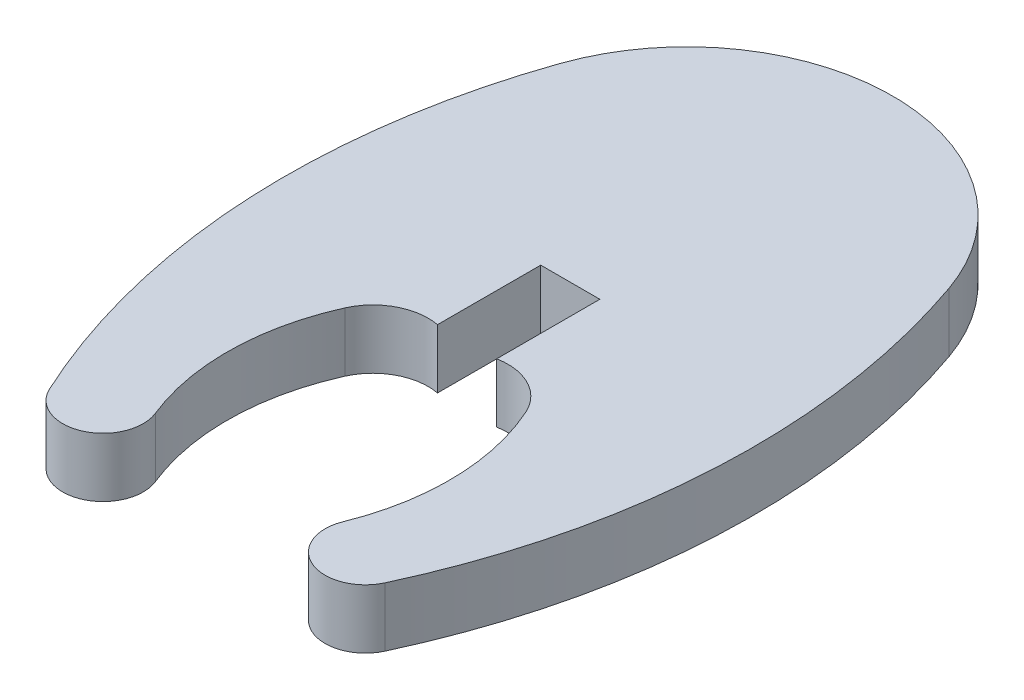
ISO-10303-21;
HEADER;
FILE_DESCRIPTION(('STEP AP214'),'2;1');
FILE_NAME('part.step','',(''),(''),'','','');
FILE_SCHEMA(('AUTOMOTIVE_DESIGN { 1 0 10303 214 1 1 1 1 }'));
ENDSEC;
DATA;
#1=APPLICATION_CONTEXT('core data for automotive mechanical design processes');
#2=APPLICATION_PROTOCOL_DEFINITION('international standard','automotive_design',2000,#1);
#3=PRODUCT_CONTEXT('',#1,'mechanical');
#4=PRODUCT('Part','Part','',(#3));
#5=PRODUCT_RELATED_PRODUCT_CATEGORY('part','',(#4));
#6=PRODUCT_DEFINITION_FORMATION('','',#4);
#7=PRODUCT_DEFINITION_CONTEXT('part definition',#1,'design');
#8=PRODUCT_DEFINITION('design','',#6,#7);
#9=PRODUCT_DEFINITION_SHAPE('','',#8);
#10=(LENGTH_UNIT() NAMED_UNIT(*) SI_UNIT(.MILLI.,.METRE.));
#11=(NAMED_UNIT(*) PLANE_ANGLE_UNIT() SI_UNIT($,.RADIAN.));
#12=(NAMED_UNIT(*) SI_UNIT($,.STERADIAN.) SOLID_ANGLE_UNIT());
#13=UNCERTAINTY_MEASURE_WITH_UNIT(LENGTH_MEASURE(1.E-05),#10,'distance_accuracy_value','');
#14=(GEOMETRIC_REPRESENTATION_CONTEXT(3) GLOBAL_UNCERTAINTY_ASSIGNED_CONTEXT((#13)) GLOBAL_UNIT_ASSIGNED_CONTEXT((#10,
#11,#12)) REPRESENTATION_CONTEXT('',''));
#15=CARTESIAN_POINT('',(0.,0.,0.));
#16=DIRECTION('',(0.,0.,1.));
#17=DIRECTION('',(1.,0.,0.));
#18=AXIS2_PLACEMENT_3D('',#15,#16,#17);
#19=CARTESIAN_POINT('',(-41929.9570312742,3.,-18428.970702857));
#20=DIRECTION('',(0.,-1.,0.));
#21=DIRECTION('',(0.,0.,-1.));
#22=AXIS2_PLACEMENT_3D('',#19,#20,#21);
#23=CYLINDRICAL_SURFACE('',#22,2.80482293179841);
#24=CARTESIAN_POINT('',(-41929.9570312742,0.,-18428.970702857));
#25=DIRECTION('',(0.,-1.,0.));
#26=DIRECTION('',(0.,0.,1.));
#27=AXIS2_PLACEMENT_3D('',#24,#25,#26);
#28=CIRCLE('',#27,2.80482293179841);
#29=CARTESIAN_POINT('',(-41932.516145,0.,-18430.118731));
#30=VERTEX_POINT('',#29);
#31=CARTESIAN_POINT('',(-41929.434079,0.,-18431.726343));
#32=VERTEX_POINT('',#31);
#33=EDGE_CURVE('E155',#30,#32,#28,.T.);
#34=ORIENTED_EDGE('',*,*,#33,.T.);
#35=DIRECTION('',(0.,-1.,0.));
#36=VECTOR('',#35,1.);
#37=CARTESIAN_POINT('',(-41929.434079,3.,-18431.726343));
#38=LINE('',#37,#36);
#39=CARTESIAN_POINT('',(-41929.434079,3.,-18431.726343));
#40=VERTEX_POINT('',#39);
#41=EDGE_CURVE('E11',#40,#32,#38,.T.);
#42=ORIENTED_EDGE('',*,*,#41,.F.);
#43=CARTESIAN_POINT('',(-41929.9570312742,3.,-18428.970702857));
#44=DIRECTION('',(0.,-1.,0.));
#45=DIRECTION('',(0.,0.,1.));
#46=AXIS2_PLACEMENT_3D('',#43,#44,#45);
#47=CIRCLE('',#46,2.80482293179841);
#48=CARTESIAN_POINT('',(-41932.516145,3.,-18430.118731));
#49=VERTEX_POINT('',#48);
#50=EDGE_CURVE('E177',#49,#40,#47,.T.);
#51=ORIENTED_EDGE('',*,*,#50,.F.);
#52=DIRECTION('',(0.,-1.,0.));
#53=VECTOR('',#52,1.);
#54=CARTESIAN_POINT('',(-41932.516145,3.,-18430.118731));
#55=LINE('',#54,#53);
#56=EDGE_CURVE('E151',#49,#30,#55,.T.);
#57=ORIENTED_EDGE('',*,*,#56,.T.);
#58=EDGE_LOOP('',(#34,#42,#51,#57));
#59=FACE_BOUND('',#58,.T.);
#60=ADVANCED_FACE('F35',(#59),#23,.F.);
#61=CARTESIAN_POINT('',(-41929.429687,3.,-18436.955078));
#62=DIRECTION('',(-0.999999647222254,0.,-0.000839973432798519));
#63=DIRECTION('',(-0.000839973432798519,0.,0.999999647222254));
#64=AXIS2_PLACEMENT_3D('',#61,#62,#63);
#65=PLANE('',#64);
#66=DIRECTION('',(0.000839973432798519,0.,-0.999999647222254));
#67=VECTOR('',#66,1.);
#68=CARTESIAN_POINT('',(-41929.429687,0.,-18436.955078));
#69=LINE('',#68,#67);
#70=CARTESIAN_POINT('',(-41929.429687,0.,-18436.955078));
#71=VERTEX_POINT('',#70);
#72=EDGE_CURVE('E158',#32,#71,#69,.T.);
#73=ORIENTED_EDGE('',*,*,#72,.T.);
#74=DIRECTION('',(0.,-1.,0.));
#75=VECTOR('',#74,1.);
#76=CARTESIAN_POINT('',(-41929.429687,3.,-18436.955078));
#77=LINE('',#76,#75);
#78=CARTESIAN_POINT('',(-41929.429687,3.,-18436.955078));
#79=VERTEX_POINT('',#78);
#80=EDGE_CURVE('E43',#79,#71,#77,.T.);
#81=ORIENTED_EDGE('',*,*,#80,.F.);
#82=DIRECTION('',(0.000839973432798519,0.,-0.999999647222254));
#83=VECTOR('',#82,1.);
#84=CARTESIAN_POINT('',(-41929.429687,3.,-18436.955078));
#85=LINE('',#84,#83);
#86=EDGE_CURVE('E106',#40,#79,#85,.T.);
#87=ORIENTED_EDGE('',*,*,#86,.F.);
#88=ORIENTED_EDGE('',*,*,#41,.T.);
#89=EDGE_LOOP('',(#73,#81,#87,#88));
#90=FACE_BOUND('',#89,.T.);
#91=ADVANCED_FACE('F255',(#90),#65,.F.);
#92=CARTESIAN_POINT('',(-41926.433594,3.,-18436.955078));
#93=DIRECTION('',(0.,0.,-1.));
#94=DIRECTION('',(-1.,0.,0.));
#95=AXIS2_PLACEMENT_3D('',#92,#93,#94);
#96=PLANE('',#95);
#97=DIRECTION('',(1.,0.,0.));
#98=VECTOR('',#97,1.);
#99=CARTESIAN_POINT('',(-41926.433594,0.,-18436.955078));
#100=LINE('',#99,#98);
#101=CARTESIAN_POINT('',(-41926.433594,0.,-18436.955078));
#102=VERTEX_POINT('',#101);
#103=EDGE_CURVE('E160',#71,#102,#100,.T.);
#104=ORIENTED_EDGE('',*,*,#103,.T.);
#105=DIRECTION('',(0.,-1.,0.));
#106=VECTOR('',#105,1.);
#107=CARTESIAN_POINT('',(-41926.433594,3.,-18436.955078));
#108=LINE('',#107,#106);
#109=CARTESIAN_POINT('',(-41926.433594,3.,-18436.955078));
#110=VERTEX_POINT('',#109);
#111=EDGE_CURVE('E196',#110,#102,#108,.T.);
#112=ORIENTED_EDGE('',*,*,#111,.F.);
#113=DIRECTION('',(1.,0.,0.));
#114=VECTOR('',#113,1.);
#115=CARTESIAN_POINT('',(-41926.433594,3.,-18436.955078));
#116=LINE('',#115,#114);
#117=EDGE_CURVE('E204',#79,#110,#116,.T.);
#118=ORIENTED_EDGE('',*,*,#117,.F.);
#119=ORIENTED_EDGE('',*,*,#80,.T.);
#120=EDGE_LOOP('',(#104,#112,#118,#119));
#121=FACE_BOUND('',#120,.T.);
#122=ADVANCED_FACE('F202',(#121),#96,.F.);
#123=CARTESIAN_POINT('',(-41926.433962,3.,-18431.7269200001));
#124=DIRECTION('',(0.999999997522759,0.,7.03880849701731E-05));
#125=DIRECTION('',(7.03880849701731E-05,0.,-0.999999997522759));
#126=AXIS2_PLACEMENT_3D('',#123,#124,#125);
#127=PLANE('',#126);
#128=DIRECTION('',(-7.03880849701731E-05,0.,0.999999997522759));
#129=VECTOR('',#128,1.);
#130=CARTESIAN_POINT('',(-41926.433962,0.,-18431.7269200001));
#131=LINE('',#130,#129);
#132=CARTESIAN_POINT('',(-41926.433962,0.,-18431.7269200001));
#133=VERTEX_POINT('',#132);
#134=EDGE_CURVE('E162',#102,#133,#131,.T.);
#135=ORIENTED_EDGE('',*,*,#134,.T.);
#136=DIRECTION('',(0.,-1.,0.));
#137=VECTOR('',#136,1.);
#138=CARTESIAN_POINT('',(-41926.433962,3.,-18431.7269200001));
#139=LINE('',#138,#137);
#140=CARTESIAN_POINT('',(-41926.433962,3.,-18431.7269200001));
#141=VERTEX_POINT('',#140);
#142=EDGE_CURVE('E193',#141,#133,#139,.T.);
#143=ORIENTED_EDGE('',*,*,#142,.F.);
#144=DIRECTION('',(-7.03880849701731E-05,0.,0.999999997522759));
#145=VECTOR('',#144,1.);
#146=CARTESIAN_POINT('',(-41926.433962,3.,-18431.7269200001));
#147=LINE('',#146,#145);
#148=EDGE_CURVE('E222',#110,#141,#147,.T.);
#149=ORIENTED_EDGE('',*,*,#148,.F.);
#150=ORIENTED_EDGE('',*,*,#111,.T.);
#151=EDGE_LOOP('',(#135,#143,#149,#150));
#152=FACE_BOUND('',#151,.T.);
#153=ADVANCED_FACE('F213',(#152),#127,.F.);
#154=CARTESIAN_POINT('',(-41925.91331424,3.,-18428.9703118411));
#155=DIRECTION('',(0.,-1.,0.));
#156=DIRECTION('',(0.,0.,-1.));
#157=AXIS2_PLACEMENT_3D('',#154,#155,#156);
#158=CYLINDRICAL_SURFACE('',#157,2.80534536770043);
#159=CARTESIAN_POINT('',(-41925.91331424,0.,-18428.9703118411));
#160=DIRECTION('',(0.,-1.,0.));
#161=DIRECTION('',(0.,0.,1.));
#162=AXIS2_PLACEMENT_3D('',#159,#160,#161);
#163=CIRCLE('',#162,2.80534536770043);
#164=CARTESIAN_POINT('',(-41923.352011,0.,-18430.114728));
#165=VERTEX_POINT('',#164);
#166=EDGE_CURVE('E164',#133,#165,#163,.T.);
#167=ORIENTED_EDGE('',*,*,#166,.T.);
#168=DIRECTION('',(0.,-1.,0.));
#169=VECTOR('',#168,1.);
#170=CARTESIAN_POINT('',(-41923.352011,3.,-18430.114728));
#171=LINE('',#170,#169);
#172=CARTESIAN_POINT('',(-41923.352011,3.,-18430.114728));
#173=VERTEX_POINT('',#172);
#174=EDGE_CURVE('E190',#173,#165,#171,.T.);
#175=ORIENTED_EDGE('',*,*,#174,.F.);
#176=CARTESIAN_POINT('',(-41925.91331424,3.,-18428.9703118411));
#177=DIRECTION('',(0.,-1.,0.));
#178=DIRECTION('',(0.,0.,1.));
#179=AXIS2_PLACEMENT_3D('',#176,#177,#178);
#180=CIRCLE('',#179,2.80534536770043);
#181=EDGE_CURVE('E219',#141,#173,#180,.T.);
#182=ORIENTED_EDGE('',*,*,#181,.F.);
#183=ORIENTED_EDGE('',*,*,#142,.T.);
#184=EDGE_LOOP('',(#167,#175,#182,#183));
#185=FACE_BOUND('',#184,.T.);
#186=ADVANCED_FACE('F217',(#185),#158,.F.);
#187=CARTESIAN_POINT('',(-41934.351555009,3.,-18425.1910314991));
#188=DIRECTION('',(0.,-1.,0.));
#189=DIRECTION('',(0.,0.,-1.));
#190=AXIS2_PLACEMENT_3D('',#187,#188,#189);
#191=CYLINDRICAL_SURFACE('',#190,12.0512553552966);
#192=CARTESIAN_POINT('',(-41934.351555009,0.,-18425.1910314991));
#193=DIRECTION('',(0.,-1.,0.));
#194=DIRECTION('',(0.,0.,1.));
#195=AXIS2_PLACEMENT_3D('',#192,#193,#194);
#196=CIRCLE('',#195,12.0512553552966);
#197=CARTESIAN_POINT('',(-41923.17591,0.,-18420.681296));
#198=VERTEX_POINT('',#197);
#199=EDGE_CURVE('E166',#165,#198,#196,.T.);
#200=ORIENTED_EDGE('',*,*,#199,.T.);
#201=DIRECTION('',(0.,-1.,0.));
#202=VECTOR('',#201,1.);
#203=CARTESIAN_POINT('',(-41923.17591,3.,-18420.681296));
#204=LINE('',#203,#202);
#205=CARTESIAN_POINT('',(-41923.17591,3.,-18420.681296));
#206=VERTEX_POINT('',#205);
#207=EDGE_CURVE('E187',#206,#198,#204,.T.);
#208=ORIENTED_EDGE('',*,*,#207,.F.);
#209=CARTESIAN_POINT('',(-41934.351555009,3.,-18425.1910314991));
#210=DIRECTION('',(0.,-1.,0.));
#211=DIRECTION('',(0.,0.,1.));
#212=AXIS2_PLACEMENT_3D('',#209,#210,#211);
#213=CIRCLE('',#212,12.0512553552966);
#214=EDGE_CURVE('E221',#173,#206,#213,.T.);
#215=ORIENTED_EDGE('',*,*,#214,.F.);
#216=ORIENTED_EDGE('',*,*,#174,.T.);
#217=EDGE_LOOP('',(#200,#208,#215,#216));
#218=FACE_BOUND('',#217,.T.);
#219=ADVANCED_FACE('F268',(#218),#191,.F.);
#220=CARTESIAN_POINT('',(-41921.2826689459,3.,-18419.9185842893));
#221=DIRECTION('',(0.,-1.,0.));
#222=DIRECTION('',(0.,0.,-1.));
#223=AXIS2_PLACEMENT_3D('',#220,#221,#222);
#224=CYLINDRICAL_SURFACE('',#223,2.04110039990006);
#225=CARTESIAN_POINT('',(-41921.2826689459,0.,-18419.9185842893));
#226=DIRECTION('',(0.,1.,0.));
#227=DIRECTION('',(0.,0.,1.));
#228=AXIS2_PLACEMENT_3D('',#225,#226,#227);
#229=CIRCLE('',#228,2.04110039990006);
#230=CARTESIAN_POINT('',(-41919.431945,0.,-18419.057822));
#231=VERTEX_POINT('',#230);
#232=EDGE_CURVE('E168',#198,#231,#229,.T.);
#233=ORIENTED_EDGE('',*,*,#232,.T.);
#234=DIRECTION('',(0.,-1.,0.));
#235=VECTOR('',#234,1.);
#236=CARTESIAN_POINT('',(-41919.431945,3.,-18419.057822));
#237=LINE('',#236,#235);
#238=CARTESIAN_POINT('',(-41919.431945,3.,-18419.057822));
#239=VERTEX_POINT('',#238);
#240=EDGE_CURVE('E184',#239,#231,#237,.T.);
#241=ORIENTED_EDGE('',*,*,#240,.F.);
#242=CARTESIAN_POINT('',(-41921.2826689459,3.,-18419.9185842893));
#243=DIRECTION('',(0.,1.,0.));
#244=DIRECTION('',(0.,0.,1.));
#245=AXIS2_PLACEMENT_3D('',#242,#243,#244);
#246=CIRCLE('',#245,2.04110039990006);
#247=EDGE_CURVE('E224',#206,#239,#246,.T.);
#248=ORIENTED_EDGE('',*,*,#247,.F.);
#249=ORIENTED_EDGE('',*,*,#207,.T.);
#250=EDGE_LOOP('',(#233,#241,#248,#249));
#251=FACE_BOUND('',#250,.T.);
#252=ADVANCED_FACE('F271',(#251),#224,.T.);
#253=CARTESIAN_POINT('',(-41952.3709491353,3.,-18434.3583582843));
#254=DIRECTION('',(0.,-1.,0.));
#255=DIRECTION('',(0.,0.,-1.));
#256=AXIS2_PLACEMENT_3D('',#253,#254,#255);
#257=CYLINDRICAL_SURFACE('',#256,36.3192015883005);
#258=CARTESIAN_POINT('',(-41952.3709491353,0.,-18434.3583582843));
#259=DIRECTION('',(0.,1.,0.));
#260=DIRECTION('',(0.,0.,1.));
#261=AXIS2_PLACEMENT_3D('',#258,#259,#260);
#262=CIRCLE('',#261,36.3192015883005);
#263=CARTESIAN_POINT('',(-41918.066692,0.,-18446.2874129999));
#264=VERTEX_POINT('',#263);
#265=EDGE_CURVE('E170',#231,#264,#262,.T.);
#266=ORIENTED_EDGE('',*,*,#265,.T.);
#267=DIRECTION('',(0.,-1.,0.));
#268=VECTOR('',#267,1.);
#269=CARTESIAN_POINT('',(-41918.066692,3.,-18446.2874129999));
#270=LINE('',#269,#268);
#271=CARTESIAN_POINT('',(-41918.066692,3.,-18446.2874129999));
#272=VERTEX_POINT('',#271);
#273=EDGE_CURVE('E181',#272,#264,#270,.T.);
#274=ORIENTED_EDGE('',*,*,#273,.F.);
#275=CARTESIAN_POINT('',(-41952.3709491353,3.,-18434.3583582843));
#276=DIRECTION('',(0.,1.,0.));
#277=DIRECTION('',(0.,0.,1.));
#278=AXIS2_PLACEMENT_3D('',#275,#276,#277);
#279=CIRCLE('',#278,36.3192015883005);
#280=EDGE_CURVE('E230',#239,#272,#279,.T.);
#281=ORIENTED_EDGE('',*,*,#280,.F.);
#282=ORIENTED_EDGE('',*,*,#240,.T.);
#283=EDGE_LOOP('',(#266,#274,#281,#282));
#284=FACE_BOUND('',#283,.T.);
#285=ADVANCED_FACE('F236',(#284),#257,.T.);
#286=CARTESIAN_POINT('',(-41927.9320170109,3.,-18442.8554694652));
#287=DIRECTION('',(0.,-1.,0.));
#288=DIRECTION('',(0.,0.,-1.));
#289=AXIS2_PLACEMENT_3D('',#286,#287,#288);
#290=CYLINDRICAL_SURFACE('',#289,10.4452321178977);
#291=CARTESIAN_POINT('',(-41927.9320170109,0.,-18442.8554694652));
#292=DIRECTION('',(0.,1.,0.));
#293=DIRECTION('',(0.,0.,1.));
#294=AXIS2_PLACEMENT_3D('',#291,#292,#293);
#295=CIRCLE('',#294,10.4452321178977);
#296=CARTESIAN_POINT('',(-41937.7959589999,0.,-18446.291386));
#297=VERTEX_POINT('',#296);
#298=EDGE_CURVE('E172',#264,#297,#295,.T.);
#299=ORIENTED_EDGE('',*,*,#298,.T.);
#300=DIRECTION('',(0.,-1.,0.));
#301=VECTOR('',#300,1.);
#302=CARTESIAN_POINT('',(-41937.7959589999,3.,-18446.291386));
#303=LINE('',#302,#301);
#304=CARTESIAN_POINT('',(-41937.7959589999,3.,-18446.291386));
#305=VERTEX_POINT('',#304);
#306=EDGE_CURVE('E146',#305,#297,#303,.T.);
#307=ORIENTED_EDGE('',*,*,#306,.F.);
#308=CARTESIAN_POINT('',(-41927.9320170109,3.,-18442.8554694652));
#309=DIRECTION('',(0.,1.,0.));
#310=DIRECTION('',(0.,0.,1.));
#311=AXIS2_PLACEMENT_3D('',#308,#309,#310);
#312=CIRCLE('',#311,10.4452321178977);
#313=EDGE_CURVE('E137',#272,#305,#312,.T.);
#314=ORIENTED_EDGE('',*,*,#313,.F.);
#315=ORIENTED_EDGE('',*,*,#273,.T.);
#316=EDGE_LOOP('',(#299,#307,#314,#315));
#317=FACE_BOUND('',#316,.T.);
#318=ADVANCED_FACE('F240',(#317),#290,.T.);
#319=CARTESIAN_POINT('',(-41903.5005204478,3.,-18434.3522409953));
#320=DIRECTION('',(0.,-1.,0.));
#321=DIRECTION('',(0.,0.,-1.));
#322=AXIS2_PLACEMENT_3D('',#319,#320,#321);
#323=CYLINDRICAL_SURFACE('',#322,36.3141885346039);
#324=CARTESIAN_POINT('',(-41903.5005204478,0.,-18434.3522409953));
#325=DIRECTION('',(0.,1.,0.));
#326=DIRECTION('',(0.,0.,1.));
#327=AXIS2_PLACEMENT_3D('',#324,#325,#326);
#328=CIRCLE('',#327,36.3141885346039);
#329=CARTESIAN_POINT('',(-41936.4390910001,0.,-18419.062674));
#330=VERTEX_POINT('',#329);
#331=EDGE_CURVE('E145',#297,#330,#328,.T.);
#332=ORIENTED_EDGE('',*,*,#331,.T.);
#333=DIRECTION('',(0.,-1.,0.));
#334=VECTOR('',#333,1.);
#335=CARTESIAN_POINT('',(-41936.4390910001,3.,-18419.062674));
#336=LINE('',#335,#334);
#337=CARTESIAN_POINT('',(-41936.4390910001,3.,-18419.062674));
#338=VERTEX_POINT('',#337);
#339=EDGE_CURVE('E142',#338,#330,#336,.T.);
#340=ORIENTED_EDGE('',*,*,#339,.F.);
#341=CARTESIAN_POINT('',(-41903.5005204478,3.,-18434.3522409953));
#342=DIRECTION('',(0.,1.,0.));
#343=DIRECTION('',(0.,0.,1.));
#344=AXIS2_PLACEMENT_3D('',#341,#342,#343);
#345=CIRCLE('',#344,36.3141885346039);
#346=EDGE_CURVE('E131',#305,#338,#345,.T.);
#347=ORIENTED_EDGE('',*,*,#346,.F.);
#348=ORIENTED_EDGE('',*,*,#306,.T.);
#349=EDGE_LOOP('',(#332,#340,#347,#348));
#350=FACE_BOUND('',#349,.T.);
#351=ADVANCED_FACE('F143',(#350),#323,.T.);
#352=CARTESIAN_POINT('',(-41934.5868084854,3.,-18419.9214976946));
#353=DIRECTION('',(0.,-1.,0.));
#354=DIRECTION('',(0.,0.,-1.));
#355=AXIS2_PLACEMENT_3D('',#352,#353,#354);
#356=CYLINDRICAL_SURFACE('',#355,2.04169749289779);
#357=CARTESIAN_POINT('',(-41934.5868084854,0.,-18419.9214976946));
#358=DIRECTION('',(0.,1.,0.));
#359=DIRECTION('',(0.,0.,1.));
#360=AXIS2_PLACEMENT_3D('',#357,#358,#359);
#361=CIRCLE('',#360,2.04169749289779);
#362=CARTESIAN_POINT('',(-41932.693044,0.,-18420.684508));
#363=VERTEX_POINT('',#362);
#364=EDGE_CURVE('E92',#330,#363,#361,.T.);
#365=ORIENTED_EDGE('',*,*,#364,.T.);
#366=DIRECTION('',(0.,-1.,0.));
#367=VECTOR('',#366,1.);
#368=CARTESIAN_POINT('',(-41932.693044,3.,-18420.684508));
#369=LINE('',#368,#367);
#370=CARTESIAN_POINT('',(-41932.693044,3.,-18420.684508));
#371=VERTEX_POINT('',#370);
#372=EDGE_CURVE('E147',#371,#363,#369,.T.);
#373=ORIENTED_EDGE('',*,*,#372,.F.);
#374=CARTESIAN_POINT('',(-41934.5868084854,3.,-18419.9214976946));
#375=DIRECTION('',(0.,1.,0.));
#376=DIRECTION('',(0.,0.,1.));
#377=AXIS2_PLACEMENT_3D('',#374,#375,#376);
#378=CIRCLE('',#377,2.04169749289779);
#379=EDGE_CURVE('E135',#338,#371,#378,.T.);
#380=ORIENTED_EDGE('',*,*,#379,.F.);
#381=ORIENTED_EDGE('',*,*,#339,.T.);
#382=EDGE_LOOP('',(#365,#373,#380,#381));
#383=FACE_BOUND('',#382,.T.);
#384=ADVANCED_FACE('F149',(#383),#356,.T.);
#385=CARTESIAN_POINT('',(-41921.5155455297,3.,-18425.1936912294));
#386=DIRECTION('',(0.,-1.,0.));
#387=DIRECTION('',(0.,0.,-1.));
#388=AXIS2_PLACEMENT_3D('',#385,#386,#387);
#389=CYLINDRICAL_SURFACE('',#388,12.0527675430941);
#390=CARTESIAN_POINT('',(-41921.5155455297,0.,-18425.1936912294));
#391=DIRECTION('',(0.,-1.,0.));
#392=DIRECTION('',(0.,0.,1.));
#393=AXIS2_PLACEMENT_3D('',#390,#391,#392);
#394=CIRCLE('',#393,12.0527675430941);
#395=EDGE_CURVE('E98',#363,#30,#394,.T.);
#396=ORIENTED_EDGE('',*,*,#395,.T.);
#397=ORIENTED_EDGE('',*,*,#56,.F.);
#398=CARTESIAN_POINT('',(-41921.5155455297,3.,-18425.1936912294));
#399=DIRECTION('',(0.,-1.,0.));
#400=DIRECTION('',(0.,0.,1.));
#401=AXIS2_PLACEMENT_3D('',#398,#399,#400);
#402=CIRCLE('',#401,12.0527675430941);
#403=EDGE_CURVE('E51',#371,#49,#402,.T.);
#404=ORIENTED_EDGE('',*,*,#403,.F.);
#405=ORIENTED_EDGE('',*,*,#372,.T.);
#406=EDGE_LOOP('',(#396,#397,#404,#405));
#407=FACE_BOUND('',#406,.T.);
#408=ADVANCED_FACE('F244',(#407),#389,.F.);
#409=CARTESIAN_POINT('',(-41929.9570312742,3.,-18428.970702857));
#410=DIRECTION('',(0.,1.,0.));
#411=DIRECTION('',(0.,0.,1.));
#412=AXIS2_PLACEMENT_3D('',#409,#410,#411);
#413=PLANE('',#412);
#414=ORIENTED_EDGE('',*,*,#50,.T.);
#415=ORIENTED_EDGE('',*,*,#86,.T.);
#416=ORIENTED_EDGE('',*,*,#117,.T.);
#417=ORIENTED_EDGE('',*,*,#148,.T.);
#418=ORIENTED_EDGE('',*,*,#181,.T.);
#419=ORIENTED_EDGE('',*,*,#214,.T.);
#420=ORIENTED_EDGE('',*,*,#247,.T.);
#421=ORIENTED_EDGE('',*,*,#280,.T.);
#422=ORIENTED_EDGE('',*,*,#313,.T.);
#423=ORIENTED_EDGE('',*,*,#346,.T.);
#424=ORIENTED_EDGE('',*,*,#379,.T.);
#425=ORIENTED_EDGE('',*,*,#403,.T.);
#426=EDGE_LOOP('',(#414,#415,#416,#417,#418,#419,#420,#421,#422,#423,#424,#425));
#427=FACE_BOUND('',#426,.T.);
#428=ADVANCED_FACE('F133',(#427),#413,.T.);
#429=CARTESIAN_POINT('',(-41929.9570312742,0.,-18428.970702857));
#430=DIRECTION('',(0.,1.,0.));
#431=DIRECTION('',(0.,0.,1.));
#432=AXIS2_PLACEMENT_3D('',#429,#430,#431);
#433=PLANE('',#432);
#434=ORIENTED_EDGE('',*,*,#33,.F.);
#435=ORIENTED_EDGE('',*,*,#395,.F.);
#436=ORIENTED_EDGE('',*,*,#364,.F.);
#437=ORIENTED_EDGE('',*,*,#331,.F.);
#438=ORIENTED_EDGE('',*,*,#298,.F.);
#439=ORIENTED_EDGE('',*,*,#265,.F.);
#440=ORIENTED_EDGE('',*,*,#232,.F.);
#441=ORIENTED_EDGE('',*,*,#199,.F.);
#442=ORIENTED_EDGE('',*,*,#166,.F.);
#443=ORIENTED_EDGE('',*,*,#134,.F.);
#444=ORIENTED_EDGE('',*,*,#103,.F.);
#445=ORIENTED_EDGE('',*,*,#72,.F.);
#446=EDGE_LOOP('',(#434,#435,#436,#437,#438,#439,#440,#441,#442,#443,#444,#445));
#447=FACE_BOUND('',#446,.T.);
#448=ADVANCED_FACE('F208',(#447),#433,.F.);
#449=CLOSED_SHELL('',(#60,#91,#122,#153,#186,#219,#252,#285,#318,#351,#384,#408,#428,#448));
#450=MANIFOLD_SOLID_BREP('B2',#449);
#451=ADVANCED_BREP_SHAPE_REPRESENTATION('',(#18,#450),#14);
#452=SHAPE_DEFINITION_REPRESENTATION(#9,#451);
ENDSEC;
END-ISO-10303-21;
